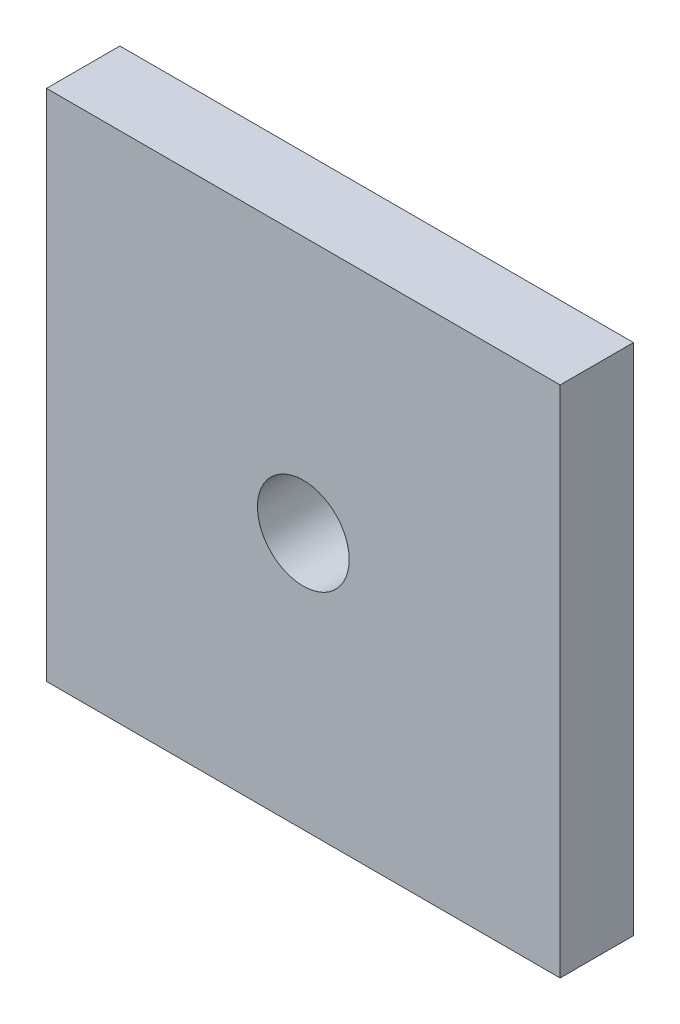
ISO-10303-21;
HEADER;
FILE_DESCRIPTION(('STEP AP214'),'2;1');
FILE_NAME('part.step','',(''),(''),'','','');
FILE_SCHEMA(('AUTOMOTIVE_DESIGN { 1 0 10303 214 1 1 1 1 }'));
ENDSEC;
DATA;
#1=APPLICATION_CONTEXT('core data for automotive mechanical design processes');
#2=APPLICATION_PROTOCOL_DEFINITION('international standard','automotive_design',2000,#1);
#3=PRODUCT_CONTEXT('',#1,'mechanical');
#4=PRODUCT('Part','Part','',(#3));
#5=PRODUCT_RELATED_PRODUCT_CATEGORY('part','',(#4));
#6=PRODUCT_DEFINITION_FORMATION('','',#4);
#7=PRODUCT_DEFINITION_CONTEXT('part definition',#1,'design');
#8=PRODUCT_DEFINITION('design','',#6,#7);
#9=PRODUCT_DEFINITION_SHAPE('','',#8);
#10=(LENGTH_UNIT() NAMED_UNIT(*) SI_UNIT(.MILLI.,.METRE.));
#11=(NAMED_UNIT(*) PLANE_ANGLE_UNIT() SI_UNIT($,.RADIAN.));
#12=(NAMED_UNIT(*) SI_UNIT($,.STERADIAN.) SOLID_ANGLE_UNIT());
#13=UNCERTAINTY_MEASURE_WITH_UNIT(LENGTH_MEASURE(1.E-05),#10,'distance_accuracy_value','');
#14=(GEOMETRIC_REPRESENTATION_CONTEXT(3) GLOBAL_UNCERTAINTY_ASSIGNED_CONTEXT((#13)) GLOBAL_UNIT_ASSIGNED_CONTEXT((#10,
#11,#12)) REPRESENTATION_CONTEXT('',''));
#15=CARTESIAN_POINT('',(0.,0.,0.));
#16=DIRECTION('',(0.,0.,1.));
#17=DIRECTION('',(1.,0.,0.));
#18=AXIS2_PLACEMENT_3D('',#15,#16,#17);
#19=CARTESIAN_POINT('',(0.,0.,80.));
#20=DIRECTION('',(0.,0.,1.));
#21=DIRECTION('',(1.,0.,0.));
#22=AXIS2_PLACEMENT_3D('',#19,#20,#21);
#23=PLANE('',#22);
#24=DIRECTION('',(0.,1.,0.));
#25=VECTOR('',#24,1.);
#26=CARTESIAN_POINT('',(598.999999999414,-62.9999999995484,80.));
#27=LINE('',#26,#25);
#28=CARTESIAN_POINT('',(598.999999999414,-622.999999999549,80.));
#29=VERTEX_POINT('',#28);
#30=CARTESIAN_POINT('',(598.999999999414,-62.9999999995484,80.));
#31=VERTEX_POINT('',#30);
#32=EDGE_CURVE('E69',#29,#31,#27,.T.);
#33=ORIENTED_EDGE('',*,*,#32,.T.);
#34=DIRECTION('',(-1.,0.,0.));
#35=VECTOR('',#34,1.);
#36=CARTESIAN_POINT('',(38.9999999994141,-62.9999999995484,80.));
#37=LINE('',#36,#35);
#38=CARTESIAN_POINT('',(38.9999999994141,-62.9999999995484,80.));
#39=VERTEX_POINT('',#38);
#40=EDGE_CURVE('E64',#31,#39,#37,.T.);
#41=ORIENTED_EDGE('',*,*,#40,.T.);
#42=DIRECTION('',(0.,-1.,0.));
#43=VECTOR('',#42,1.);
#44=CARTESIAN_POINT('',(38.9999999994141,-62.9999999995484,80.));
#45=LINE('',#44,#43);
#46=CARTESIAN_POINT('',(38.9999999994142,-622.999999999549,80.));
#47=VERTEX_POINT('',#46);
#48=EDGE_CURVE('E67',#39,#47,#45,.T.);
#49=ORIENTED_EDGE('',*,*,#48,.T.);
#50=DIRECTION('',(1.,0.,0.));
#51=VECTOR('',#50,1.);
#52=CARTESIAN_POINT('',(38.9999999994142,-622.999999999549,80.));
#53=LINE('',#52,#51);
#54=EDGE_CURVE('E34',#47,#29,#53,.T.);
#55=ORIENTED_EDGE('',*,*,#54,.T.);
#56=EDGE_LOOP('',(#33,#41,#49,#55));
#57=FACE_BOUND('',#56,.T.);
#58=CARTESIAN_POINT('',(318.999999999414,-342.999999999548,80.));
#59=DIRECTION('',(0.,0.,1.));
#60=DIRECTION('',(1.,0.,0.));
#61=AXIS2_PLACEMENT_3D('',#58,#59,#60);
#62=CIRCLE('',#61,50.);
#63=CARTESIAN_POINT('',(368.999999999414,-342.999999999548,80.));
#64=VERTEX_POINT('',#63);
#65=EDGE_CURVE('E84',#64,#64,#62,.T.);
#66=ORIENTED_EDGE('',*,*,#65,.F.);
#67=EDGE_LOOP('',(#66));
#68=FACE_BOUND('',#67,.T.);
#69=ADVANCED_FACE('F17',(#57,#68),#23,.T.);
#70=CARTESIAN_POINT('',(0.,0.,0.));
#71=DIRECTION('',(0.,0.,1.));
#72=DIRECTION('',(1.,0.,0.));
#73=AXIS2_PLACEMENT_3D('',#70,#71,#72);
#74=PLANE('',#73);
#75=DIRECTION('',(0.,1.,0.));
#76=VECTOR('',#75,1.);
#77=CARTESIAN_POINT('',(598.999999999414,-62.9999999995484,0.));
#78=LINE('',#77,#76);
#79=CARTESIAN_POINT('',(598.999999999414,-622.999999999549,0.));
#80=VERTEX_POINT('',#79);
#81=CARTESIAN_POINT('',(598.999999999414,-62.9999999995484,0.));
#82=VERTEX_POINT('',#81);
#83=EDGE_CURVE('E81',#80,#82,#78,.T.);
#84=ORIENTED_EDGE('',*,*,#83,.F.);
#85=DIRECTION('',(1.,0.,0.));
#86=VECTOR('',#85,1.);
#87=CARTESIAN_POINT('',(38.9999999994142,-622.999999999549,0.));
#88=LINE('',#87,#86);
#89=CARTESIAN_POINT('',(38.9999999994142,-622.999999999549,0.));
#90=VERTEX_POINT('',#89);
#91=EDGE_CURVE('E57',#90,#80,#88,.T.);
#92=ORIENTED_EDGE('',*,*,#91,.F.);
#93=DIRECTION('',(0.,-1.,0.));
#94=VECTOR('',#93,1.);
#95=CARTESIAN_POINT('',(38.9999999994141,-62.9999999995484,0.));
#96=LINE('',#95,#94);
#97=CARTESIAN_POINT('',(38.9999999994141,-62.9999999995484,0.));
#98=VERTEX_POINT('',#97);
#99=EDGE_CURVE('E51',#98,#90,#96,.T.);
#100=ORIENTED_EDGE('',*,*,#99,.F.);
#101=DIRECTION('',(-1.,0.,0.));
#102=VECTOR('',#101,1.);
#103=CARTESIAN_POINT('',(38.9999999994141,-62.9999999995484,0.));
#104=LINE('',#103,#102);
#105=EDGE_CURVE('E73',#82,#98,#104,.T.);
#106=ORIENTED_EDGE('',*,*,#105,.F.);
#107=EDGE_LOOP('',(#84,#92,#100,#106));
#108=FACE_BOUND('',#107,.T.);
#109=CARTESIAN_POINT('',(318.999999999414,-342.999999999548,0.));
#110=DIRECTION('',(0.,0.,1.));
#111=DIRECTION('',(1.,0.,0.));
#112=AXIS2_PLACEMENT_3D('',#109,#110,#111);
#113=CIRCLE('',#112,50.);
#114=CARTESIAN_POINT('',(368.999999999414,-342.999999999548,0.));
#115=VERTEX_POINT('',#114);
#116=EDGE_CURVE('E96',#115,#115,#113,.T.);
#117=ORIENTED_EDGE('',*,*,#116,.T.);
#118=EDGE_LOOP('',(#117));
#119=FACE_BOUND('',#118,.T.);
#120=ADVANCED_FACE('F92',(#108,#119),#74,.F.);
#121=CARTESIAN_POINT('',(598.999999999414,-62.9999999995484,80.));
#122=DIRECTION('',(-1.,0.,0.));
#123=DIRECTION('',(0.,-1.,0.));
#124=AXIS2_PLACEMENT_3D('',#121,#122,#123);
#125=PLANE('',#124);
#126=ORIENTED_EDGE('',*,*,#83,.T.);
#127=DIRECTION('',(0.,0.,-1.));
#128=VECTOR('',#127,1.);
#129=CARTESIAN_POINT('',(598.999999999414,-62.9999999995484,80.));
#130=LINE('',#129,#128);
#131=EDGE_CURVE('E11',#31,#82,#130,.T.);
#132=ORIENTED_EDGE('',*,*,#131,.F.);
#133=ORIENTED_EDGE('',*,*,#32,.F.);
#134=DIRECTION('',(0.,0.,-1.));
#135=VECTOR('',#134,1.);
#136=CARTESIAN_POINT('',(598.999999999414,-622.999999999549,80.));
#137=LINE('',#136,#135);
#138=EDGE_CURVE('E77',#29,#80,#137,.T.);
#139=ORIENTED_EDGE('',*,*,#138,.T.);
#140=EDGE_LOOP('',(#126,#132,#133,#139));
#141=FACE_BOUND('',#140,.T.);
#142=ADVANCED_FACE('F19',(#141),#125,.F.);
#143=CARTESIAN_POINT('',(38.9999999994141,-62.9999999995484,80.));
#144=DIRECTION('',(0.,-1.,0.));
#145=DIRECTION('',(0.,0.,-1.));
#146=AXIS2_PLACEMENT_3D('',#143,#144,#145);
#147=PLANE('',#146);
#148=ORIENTED_EDGE('',*,*,#105,.T.);
#149=DIRECTION('',(0.,0.,-1.));
#150=VECTOR('',#149,1.);
#151=CARTESIAN_POINT('',(38.9999999994141,-62.9999999995484,80.));
#152=LINE('',#151,#150);
#153=EDGE_CURVE('E26',#39,#98,#152,.T.);
#154=ORIENTED_EDGE('',*,*,#153,.F.);
#155=ORIENTED_EDGE('',*,*,#40,.F.);
#156=ORIENTED_EDGE('',*,*,#131,.T.);
#157=EDGE_LOOP('',(#148,#154,#155,#156));
#158=FACE_BOUND('',#157,.T.);
#159=ADVANCED_FACE('F72',(#158),#147,.F.);
#160=CARTESIAN_POINT('',(38.9999999994141,-62.9999999995484,80.));
#161=DIRECTION('',(1.,0.,0.));
#162=DIRECTION('',(0.,1.,0.));
#163=AXIS2_PLACEMENT_3D('',#160,#161,#162);
#164=PLANE('',#163);
#165=ORIENTED_EDGE('',*,*,#99,.T.);
#166=DIRECTION('',(0.,0.,-1.));
#167=VECTOR('',#166,1.);
#168=CARTESIAN_POINT('',(38.9999999994142,-622.999999999549,80.));
#169=LINE('',#168,#167);
#170=EDGE_CURVE('E74',#47,#90,#169,.T.);
#171=ORIENTED_EDGE('',*,*,#170,.F.);
#172=ORIENTED_EDGE('',*,*,#48,.F.);
#173=ORIENTED_EDGE('',*,*,#153,.T.);
#174=EDGE_LOOP('',(#165,#171,#172,#173));
#175=FACE_BOUND('',#174,.T.);
#176=ADVANCED_FACE('F75',(#175),#164,.F.);
#177=CARTESIAN_POINT('',(38.9999999994142,-622.999999999549,80.));
#178=DIRECTION('',(0.,1.,0.));
#179=DIRECTION('',(0.,0.,1.));
#180=AXIS2_PLACEMENT_3D('',#177,#178,#179);
#181=PLANE('',#180);
#182=ORIENTED_EDGE('',*,*,#91,.T.);
#183=ORIENTED_EDGE('',*,*,#138,.F.);
#184=ORIENTED_EDGE('',*,*,#54,.F.);
#185=ORIENTED_EDGE('',*,*,#170,.T.);
#186=EDGE_LOOP('',(#182,#183,#184,#185));
#187=FACE_BOUND('',#186,.T.);
#188=ADVANCED_FACE('F89',(#187),#181,.F.);
#189=CARTESIAN_POINT('',(318.999999999414,-342.999999999548,80.));
#190=DIRECTION('',(0.,0.,-1.));
#191=DIRECTION('',(-1.,0.,0.));
#192=AXIS2_PLACEMENT_3D('',#189,#190,#191);
#193=CYLINDRICAL_SURFACE('',#192,50.);
#194=ORIENTED_EDGE('',*,*,#65,.T.);
#195=EDGE_LOOP('',(#194));
#196=FACE_BOUND('',#195,.T.);
#197=ORIENTED_EDGE('',*,*,#116,.F.);
#198=EDGE_LOOP('',(#197));
#199=FACE_BOUND('',#198,.T.);
#200=ADVANCED_FACE('F102',(#196,#199),#193,.F.);
#201=CLOSED_SHELL('',(#69,#120,#142,#159,#176,#188,#200));
#202=MANIFOLD_SOLID_BREP('B1',#201);
#203=ADVANCED_BREP_SHAPE_REPRESENTATION('',(#18,#202),#14);
#204=SHAPE_DEFINITION_REPRESENTATION(#9,#203);
ENDSEC;
END-ISO-10303-21;
